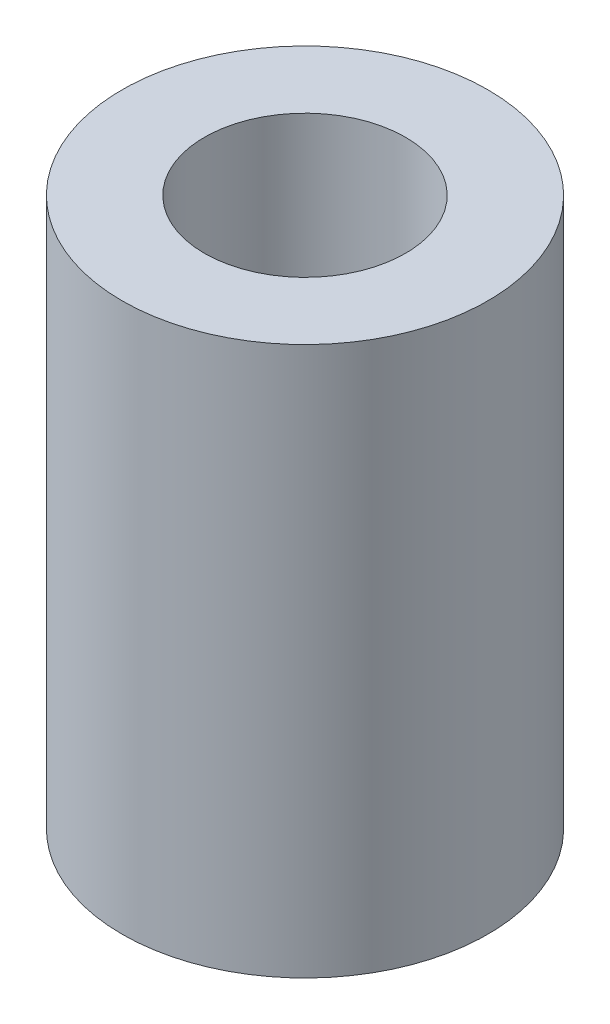
ISO-10303-21;
HEADER;
FILE_DESCRIPTION(('STEP AP214'),'2;1');
FILE_NAME('part.step','',(''),(''),'','','');
FILE_SCHEMA(('AUTOMOTIVE_DESIGN { 1 0 10303 214 1 1 1 1 }'));
ENDSEC;
DATA;
#1=APPLICATION_CONTEXT('core data for automotive mechanical design processes');
#2=APPLICATION_PROTOCOL_DEFINITION('international standard','automotive_design',2000,#1);
#3=PRODUCT_CONTEXT('',#1,'mechanical');
#4=PRODUCT('Part','Part','',(#3));
#5=PRODUCT_RELATED_PRODUCT_CATEGORY('part','',(#4));
#6=PRODUCT_DEFINITION_FORMATION('','',#4);
#7=PRODUCT_DEFINITION_CONTEXT('part definition',#1,'design');
#8=PRODUCT_DEFINITION('design','',#6,#7);
#9=PRODUCT_DEFINITION_SHAPE('','',#8);
#10=(LENGTH_UNIT() NAMED_UNIT(*) SI_UNIT(.MILLI.,.METRE.));
#11=(NAMED_UNIT(*) PLANE_ANGLE_UNIT() SI_UNIT($,.RADIAN.));
#12=(NAMED_UNIT(*) SI_UNIT($,.STERADIAN.) SOLID_ANGLE_UNIT());
#13=UNCERTAINTY_MEASURE_WITH_UNIT(LENGTH_MEASURE(1.E-05),#10,'distance_accuracy_value','');
#14=(GEOMETRIC_REPRESENTATION_CONTEXT(3) GLOBAL_UNCERTAINTY_ASSIGNED_CONTEXT((#13)) GLOBAL_UNIT_ASSIGNED_CONTEXT((#10,
#11,#12)) REPRESENTATION_CONTEXT('',''));
#15=CARTESIAN_POINT('',(0.,0.,0.));
#16=DIRECTION('',(0.,0.,1.));
#17=DIRECTION('',(1.,0.,0.));
#18=AXIS2_PLACEMENT_3D('',#15,#16,#17);
#19=CARTESIAN_POINT('',(0.,9.,0.));
#20=DIRECTION('',(0.,1.,0.));
#21=DIRECTION('',(0.,0.,1.));
#22=AXIS2_PLACEMENT_3D('',#19,#20,#21);
#23=PLANE('',#22);
#24=CARTESIAN_POINT('',(0.,9.,0.));
#25=DIRECTION('',(0.,1.,0.));
#26=DIRECTION('',(0.,0.,1.));
#27=AXIS2_PLACEMENT_3D('',#24,#25,#26);
#28=CIRCLE('',#27,3.);
#29=CARTESIAN_POINT('',(0.,9.,3.));
#30=VERTEX_POINT('',#29);
#31=EDGE_CURVE('E10',#30,#30,#28,.T.);
#32=ORIENTED_EDGE('',*,*,#31,.T.);
#33=EDGE_LOOP('',(#32));
#34=FACE_BOUND('',#33,.T.);
#35=CARTESIAN_POINT('',(0.,9.,0.));
#36=DIRECTION('',(0.,1.,0.));
#37=DIRECTION('',(0.,0.,1.));
#38=AXIS2_PLACEMENT_3D('',#35,#36,#37);
#39=CIRCLE('',#38,1.65);
#40=CARTESIAN_POINT('',(0.,9.,1.65));
#41=VERTEX_POINT('',#40);
#42=EDGE_CURVE('E48',#41,#41,#39,.T.);
#43=ORIENTED_EDGE('',*,*,#42,.F.);
#44=EDGE_LOOP('',(#43));
#45=FACE_BOUND('',#44,.T.);
#46=ADVANCED_FACE('F37',(#34,#45),#23,.T.);
#47=CARTESIAN_POINT('',(0.,0.,0.));
#48=DIRECTION('',(0.,1.,0.));
#49=DIRECTION('',(0.,0.,1.));
#50=AXIS2_PLACEMENT_3D('',#47,#48,#49);
#51=PLANE('',#50);
#52=CARTESIAN_POINT('',(0.,0.,0.));
#53=DIRECTION('',(0.,1.,0.));
#54=DIRECTION('',(0.,0.,1.));
#55=AXIS2_PLACEMENT_3D('',#52,#53,#54);
#56=CIRCLE('',#55,3.);
#57=CARTESIAN_POINT('',(0.,0.,3.));
#58=VERTEX_POINT('',#57);
#59=EDGE_CURVE('E41',#58,#58,#56,.T.);
#60=ORIENTED_EDGE('',*,*,#59,.F.);
#61=EDGE_LOOP('',(#60));
#62=FACE_BOUND('',#61,.T.);
#63=CARTESIAN_POINT('',(0.,0.,0.));
#64=DIRECTION('',(0.,1.,0.));
#65=DIRECTION('',(0.,0.,1.));
#66=AXIS2_PLACEMENT_3D('',#63,#64,#65);
#67=CIRCLE('',#66,1.65);
#68=CARTESIAN_POINT('',(0.,0.,1.65));
#69=VERTEX_POINT('',#68);
#70=EDGE_CURVE('E50',#69,#69,#67,.T.);
#71=ORIENTED_EDGE('',*,*,#70,.T.);
#72=EDGE_LOOP('',(#71));
#73=FACE_BOUND('',#72,.T.);
#74=ADVANCED_FACE('F60',(#62,#73),#51,.F.);
#75=CARTESIAN_POINT('',(0.,9.,0.));
#76=DIRECTION('',(0.,-1.,0.));
#77=DIRECTION('',(0.,0.,-1.));
#78=AXIS2_PLACEMENT_3D('',#75,#76,#77);
#79=CYLINDRICAL_SURFACE('',#78,3.);
#80=ORIENTED_EDGE('',*,*,#31,.F.);
#81=EDGE_LOOP('',(#80));
#82=FACE_BOUND('',#81,.T.);
#83=ORIENTED_EDGE('',*,*,#59,.T.);
#84=EDGE_LOOP('',(#83));
#85=FACE_BOUND('',#84,.T.);
#86=ADVANCED_FACE('F39',(#82,#85),#79,.T.);
#87=CARTESIAN_POINT('',(0.,9.,0.));
#88=DIRECTION('',(0.,-1.,0.));
#89=DIRECTION('',(0.,0.,-1.));
#90=AXIS2_PLACEMENT_3D('',#87,#88,#89);
#91=CYLINDRICAL_SURFACE('',#90,1.65);
#92=ORIENTED_EDGE('',*,*,#42,.T.);
#93=EDGE_LOOP('',(#92));
#94=FACE_BOUND('',#93,.T.);
#95=ORIENTED_EDGE('',*,*,#70,.F.);
#96=EDGE_LOOP('',(#95));
#97=FACE_BOUND('',#96,.T.);
#98=ADVANCED_FACE('F56',(#94,#97),#91,.F.);
#99=CLOSED_SHELL('',(#46,#74,#86,#98));
#100=MANIFOLD_SOLID_BREP('B2',#99);
#101=ADVANCED_BREP_SHAPE_REPRESENTATION('',(#18,#100),#14);
#102=SHAPE_DEFINITION_REPRESENTATION(#9,#101);
ENDSEC;
END-ISO-10303-21;
